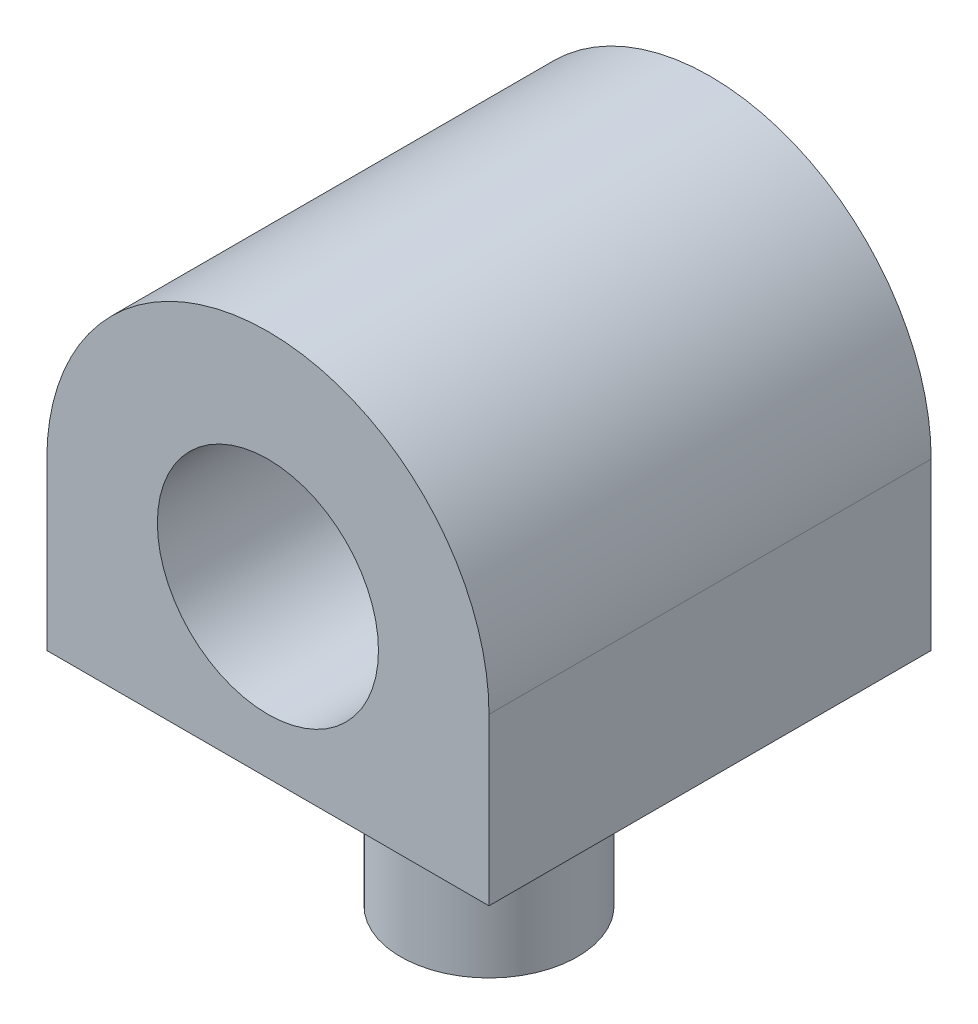
ISO-10303-21;
HEADER;
FILE_DESCRIPTION(('STEP AP214'),'2;1');
FILE_NAME('part.step','',(''),(''),'','','');
FILE_SCHEMA(('AUTOMOTIVE_DESIGN { 1 0 10303 214 1 1 1 1 }'));
ENDSEC;
DATA;
#1=APPLICATION_CONTEXT('core data for automotive mechanical design processes');
#2=APPLICATION_PROTOCOL_DEFINITION('international standard','automotive_design',2000,#1);
#3=PRODUCT_CONTEXT('',#1,'mechanical');
#4=PRODUCT('Part','Part','',(#3));
#5=PRODUCT_RELATED_PRODUCT_CATEGORY('part','',(#4));
#6=PRODUCT_DEFINITION_FORMATION('','',#4);
#7=PRODUCT_DEFINITION_CONTEXT('part definition',#1,'design');
#8=PRODUCT_DEFINITION('design','',#6,#7);
#9=PRODUCT_DEFINITION_SHAPE('','',#8);
#10=(LENGTH_UNIT() NAMED_UNIT(*) SI_UNIT(.MILLI.,.METRE.));
#11=(NAMED_UNIT(*) PLANE_ANGLE_UNIT() SI_UNIT($,.RADIAN.));
#12=(NAMED_UNIT(*) SI_UNIT($,.STERADIAN.) SOLID_ANGLE_UNIT());
#13=UNCERTAINTY_MEASURE_WITH_UNIT(LENGTH_MEASURE(1.E-05),#10,'distance_accuracy_value','');
#14=(GEOMETRIC_REPRESENTATION_CONTEXT(3) GLOBAL_UNCERTAINTY_ASSIGNED_CONTEXT((#13)) GLOBAL_UNIT_ASSIGNED_CONTEXT((#10,
#11,#12)) REPRESENTATION_CONTEXT('',''));
#15=CARTESIAN_POINT('',(0.,0.,0.));
#16=DIRECTION('',(0.,0.,1.));
#17=DIRECTION('',(1.,0.,0.));
#18=AXIS2_PLACEMENT_3D('',#15,#16,#17);
#19=CARTESIAN_POINT('',(0.,0.,20.));
#20=DIRECTION('',(0.,0.,-1.));
#21=DIRECTION('',(-1.,0.,0.));
#22=AXIS2_PLACEMENT_3D('',#19,#20,#21);
#23=CYLINDRICAL_SURFACE('',#22,10.);
#24=CARTESIAN_POINT('',(0.,0.,0.));
#25=DIRECTION('',(0.,0.,1.));
#26=DIRECTION('',(-1.,0.,0.));
#27=AXIS2_PLACEMENT_3D('',#24,#25,#26);
#28=CIRCLE('',#27,10.);
#29=CARTESIAN_POINT('',(10.,0.,0.));
#30=VERTEX_POINT('',#29);
#31=CARTESIAN_POINT('',(-10.,0.,0.));
#32=VERTEX_POINT('',#31);
#33=EDGE_CURVE('E105',#30,#32,#28,.T.);
#34=ORIENTED_EDGE('',*,*,#33,.T.);
#35=DIRECTION('',(0.,0.,-1.));
#36=VECTOR('',#35,1.);
#37=CARTESIAN_POINT('',(-10.,0.,20.));
#38=LINE('',#37,#36);
#39=CARTESIAN_POINT('',(-10.,0.,20.));
#40=VERTEX_POINT('',#39);
#41=EDGE_CURVE('E42',#40,#32,#38,.T.);
#42=ORIENTED_EDGE('',*,*,#41,.F.);
#43=CARTESIAN_POINT('',(0.,0.,20.));
#44=DIRECTION('',(0.,0.,1.));
#45=DIRECTION('',(-1.,0.,0.));
#46=AXIS2_PLACEMENT_3D('',#43,#44,#45);
#47=CIRCLE('',#46,10.);
#48=CARTESIAN_POINT('',(10.,0.,20.));
#49=VERTEX_POINT('',#48);
#50=EDGE_CURVE('E92',#49,#40,#47,.T.);
#51=ORIENTED_EDGE('',*,*,#50,.F.);
#52=DIRECTION('',(0.,0.,-1.));
#53=VECTOR('',#52,1.);
#54=CARTESIAN_POINT('',(10.,0.,20.));
#55=LINE('',#54,#53);
#56=EDGE_CURVE('E101',#49,#30,#55,.T.);
#57=ORIENTED_EDGE('',*,*,#56,.T.);
#58=EDGE_LOOP('',(#34,#42,#51,#57));
#59=FACE_BOUND('',#58,.T.);
#60=ADVANCED_FACE('F39',(#59),#23,.T.);
#61=CARTESIAN_POINT('',(-10.,0.,20.));
#62=DIRECTION('',(1.,0.,0.));
#63=DIRECTION('',(0.,1.,0.));
#64=AXIS2_PLACEMENT_3D('',#61,#62,#63);
#65=PLANE('',#64);
#66=DIRECTION('',(0.,-1.,0.));
#67=VECTOR('',#66,1.);
#68=CARTESIAN_POINT('',(-10.,0.,0.));
#69=LINE('',#68,#67);
#70=CARTESIAN_POINT('',(-10.,-7.5,0.));
#71=VERTEX_POINT('',#70);
#72=EDGE_CURVE('E97',#32,#71,#69,.T.);
#73=ORIENTED_EDGE('',*,*,#72,.T.);
#74=DIRECTION('',(0.,0.,-1.));
#75=VECTOR('',#74,1.);
#76=CARTESIAN_POINT('',(-10.,-7.5,20.));
#77=LINE('',#76,#75);
#78=CARTESIAN_POINT('',(-10.,-7.5,20.));
#79=VERTEX_POINT('',#78);
#80=EDGE_CURVE('E95',#79,#71,#77,.T.);
#81=ORIENTED_EDGE('',*,*,#80,.F.);
#82=DIRECTION('',(0.,-1.,0.));
#83=VECTOR('',#82,1.);
#84=CARTESIAN_POINT('',(-10.,0.,20.));
#85=LINE('',#84,#83);
#86=EDGE_CURVE('E87',#40,#79,#85,.T.);
#87=ORIENTED_EDGE('',*,*,#86,.F.);
#88=ORIENTED_EDGE('',*,*,#41,.T.);
#89=EDGE_LOOP('',(#73,#81,#87,#88));
#90=FACE_BOUND('',#89,.T.);
#91=ADVANCED_FACE('F96',(#90),#65,.F.);
#92=CARTESIAN_POINT('',(-10.,-7.5,20.));
#93=DIRECTION('',(0.,1.,0.));
#94=DIRECTION('',(0.,0.,1.));
#95=AXIS2_PLACEMENT_3D('',#92,#93,#94);
#96=PLANE('',#95);
#97=CARTESIAN_POINT('',(0.,-7.5,10.));
#98=DIRECTION('',(0.,-1.,0.));
#99=DIRECTION('',(0.,0.,-1.));
#100=AXIS2_PLACEMENT_3D('',#97,#98,#99);
#101=CIRCLE('',#100,4.);
#102=CARTESIAN_POINT('',(0.,-7.5,6.));
#103=VERTEX_POINT('',#102);
#104=EDGE_CURVE('E11',#103,#103,#101,.T.);
#105=ORIENTED_EDGE('',*,*,#104,.F.);
#106=EDGE_LOOP('',(#105));
#107=FACE_BOUND('',#106,.T.);
#108=DIRECTION('',(1.,0.,0.));
#109=VECTOR('',#108,1.);
#110=CARTESIAN_POINT('',(-10.,-7.5,0.));
#111=LINE('',#110,#109);
#112=CARTESIAN_POINT('',(10.,-7.5,0.));
#113=VERTEX_POINT('',#112);
#114=EDGE_CURVE('E73',#71,#113,#111,.T.);
#115=ORIENTED_EDGE('',*,*,#114,.T.);
#116=DIRECTION('',(0.,0.,-1.));
#117=VECTOR('',#116,1.);
#118=CARTESIAN_POINT('',(10.,-7.5,20.));
#119=LINE('',#118,#117);
#120=CARTESIAN_POINT('',(10.,-7.5,20.));
#121=VERTEX_POINT('',#120);
#122=EDGE_CURVE('E98',#121,#113,#119,.T.);
#123=ORIENTED_EDGE('',*,*,#122,.F.);
#124=DIRECTION('',(1.,0.,0.));
#125=VECTOR('',#124,1.);
#126=CARTESIAN_POINT('',(-10.,-7.5,20.));
#127=LINE('',#126,#125);
#128=EDGE_CURVE('E90',#79,#121,#127,.T.);
#129=ORIENTED_EDGE('',*,*,#128,.F.);
#130=ORIENTED_EDGE('',*,*,#80,.T.);
#131=EDGE_LOOP('',(#115,#123,#129,#130));
#132=FACE_BOUND('',#131,.T.);
#133=ADVANCED_FACE('F99',(#107,#132),#96,.F.);
#134=CARTESIAN_POINT('',(10.,-7.5,20.));
#135=DIRECTION('',(-1.,0.,0.));
#136=DIRECTION('',(0.,-1.,0.));
#137=AXIS2_PLACEMENT_3D('',#134,#135,#136);
#138=PLANE('',#137);
#139=DIRECTION('',(0.,1.,0.));
#140=VECTOR('',#139,1.);
#141=CARTESIAN_POINT('',(10.,-7.5,0.));
#142=LINE('',#141,#140);
#143=EDGE_CURVE('E79',#113,#30,#142,.T.);
#144=ORIENTED_EDGE('',*,*,#143,.T.);
#145=ORIENTED_EDGE('',*,*,#56,.F.);
#146=DIRECTION('',(0.,1.,0.));
#147=VECTOR('',#146,1.);
#148=CARTESIAN_POINT('',(10.,-7.5,20.));
#149=LINE('',#148,#147);
#150=EDGE_CURVE('E56',#121,#49,#149,.T.);
#151=ORIENTED_EDGE('',*,*,#150,.F.);
#152=ORIENTED_EDGE('',*,*,#122,.T.);
#153=EDGE_LOOP('',(#144,#145,#151,#152));
#154=FACE_BOUND('',#153,.T.);
#155=ADVANCED_FACE('F113',(#154),#138,.F.);
#156=CARTESIAN_POINT('',(0.,0.,20.));
#157=DIRECTION('',(0.,0.,-1.));
#158=DIRECTION('',(-1.,0.,0.));
#159=AXIS2_PLACEMENT_3D('',#156,#157,#158);
#160=PLANE('',#159);
#161=CARTESIAN_POINT('',(0.,0.,20.));
#162=DIRECTION('',(0.,0.,1.));
#163=DIRECTION('',(1.,0.,0.));
#164=AXIS2_PLACEMENT_3D('',#161,#162,#163);
#165=CIRCLE('',#164,5.);
#166=CARTESIAN_POINT('',(5.,0.,20.));
#167=VERTEX_POINT('',#166);
#168=EDGE_CURVE('E119',#167,#167,#165,.T.);
#169=ORIENTED_EDGE('',*,*,#168,.F.);
#170=EDGE_LOOP('',(#169));
#171=FACE_BOUND('',#170,.T.);
#172=ORIENTED_EDGE('',*,*,#50,.T.);
#173=ORIENTED_EDGE('',*,*,#86,.T.);
#174=ORIENTED_EDGE('',*,*,#128,.T.);
#175=ORIENTED_EDGE('',*,*,#150,.T.);
#176=EDGE_LOOP('',(#172,#173,#174,#175));
#177=FACE_BOUND('',#176,.T.);
#178=ADVANCED_FACE('F88',(#171,#177),#160,.F.);
#179=CARTESIAN_POINT('',(0.,0.,0.));
#180=DIRECTION('',(0.,0.,-1.));
#181=DIRECTION('',(-1.,0.,0.));
#182=AXIS2_PLACEMENT_3D('',#179,#180,#181);
#183=PLANE('',#182);
#184=CARTESIAN_POINT('',(0.,0.,0.));
#185=DIRECTION('',(0.,0.,1.));
#186=DIRECTION('',(1.,0.,0.));
#187=AXIS2_PLACEMENT_3D('',#184,#185,#186);
#188=CIRCLE('',#187,5.);
#189=CARTESIAN_POINT('',(5.,0.,0.));
#190=VERTEX_POINT('',#189);
#191=EDGE_CURVE('E108',#190,#190,#188,.T.);
#192=ORIENTED_EDGE('',*,*,#191,.T.);
#193=EDGE_LOOP('',(#192));
#194=FACE_BOUND('',#193,.T.);
#195=ORIENTED_EDGE('',*,*,#33,.F.);
#196=ORIENTED_EDGE('',*,*,#143,.F.);
#197=ORIENTED_EDGE('',*,*,#114,.F.);
#198=ORIENTED_EDGE('',*,*,#72,.F.);
#199=EDGE_LOOP('',(#195,#196,#197,#198));
#200=FACE_BOUND('',#199,.T.);
#201=ADVANCED_FACE('F116',(#194,#200),#183,.T.);
#202=CARTESIAN_POINT('',(0.,0.,0.));
#203=DIRECTION('',(0.,0.,1.));
#204=DIRECTION('',(1.,0.,0.));
#205=AXIS2_PLACEMENT_3D('',#202,#203,#204);
#206=CYLINDRICAL_SURFACE('',#205,5.);
#207=ORIENTED_EDGE('',*,*,#191,.F.);
#208=EDGE_LOOP('',(#207));
#209=FACE_BOUND('',#208,.T.);
#210=ORIENTED_EDGE('',*,*,#168,.T.);
#211=EDGE_LOOP('',(#210));
#212=FACE_BOUND('',#211,.T.);
#213=ADVANCED_FACE('F133',(#209,#212),#206,.F.);
#214=CARTESIAN_POINT('',(0.,-17.5,10.));
#215=DIRECTION('',(0.,1.,0.));
#216=DIRECTION('',(0.,0.,1.));
#217=AXIS2_PLACEMENT_3D('',#214,#215,#216);
#218=CYLINDRICAL_SURFACE('',#217,4.);
#219=CARTESIAN_POINT('',(0.,-17.5,10.));
#220=DIRECTION('',(0.,-1.,0.));
#221=DIRECTION('',(0.,0.,-1.));
#222=AXIS2_PLACEMENT_3D('',#219,#220,#221);
#223=CIRCLE('',#222,4.);
#224=CARTESIAN_POINT('',(0.,-17.5,6.));
#225=VERTEX_POINT('',#224);
#226=EDGE_CURVE('E122',#225,#225,#223,.T.);
#227=ORIENTED_EDGE('',*,*,#226,.F.);
#228=EDGE_LOOP('',(#227));
#229=FACE_BOUND('',#228,.T.);
#230=ORIENTED_EDGE('',*,*,#104,.T.);
#231=EDGE_LOOP('',(#230));
#232=FACE_BOUND('',#231,.T.);
#233=ADVANCED_FACE('F130',(#229,#232),#218,.T.);
#234=CARTESIAN_POINT('',(0.,-17.5,10.));
#235=DIRECTION('',(0.,-1.,0.));
#236=DIRECTION('',(0.,0.,-1.));
#237=AXIS2_PLACEMENT_3D('',#234,#235,#236);
#238=PLANE('',#237);
#239=ORIENTED_EDGE('',*,*,#226,.T.);
#240=EDGE_LOOP('',(#239));
#241=FACE_BOUND('',#240,.T.);
#242=ADVANCED_FACE('F128',(#241),#238,.T.);
#243=CLOSED_SHELL('',(#60,#91,#133,#155,#178,#201,#213,#233,#242));
#244=MANIFOLD_SOLID_BREP('B2',#243);
#245=ADVANCED_BREP_SHAPE_REPRESENTATION('',(#18,#244),#14);
#246=SHAPE_DEFINITION_REPRESENTATION(#9,#245);
ENDSEC;
END-ISO-10303-21;
